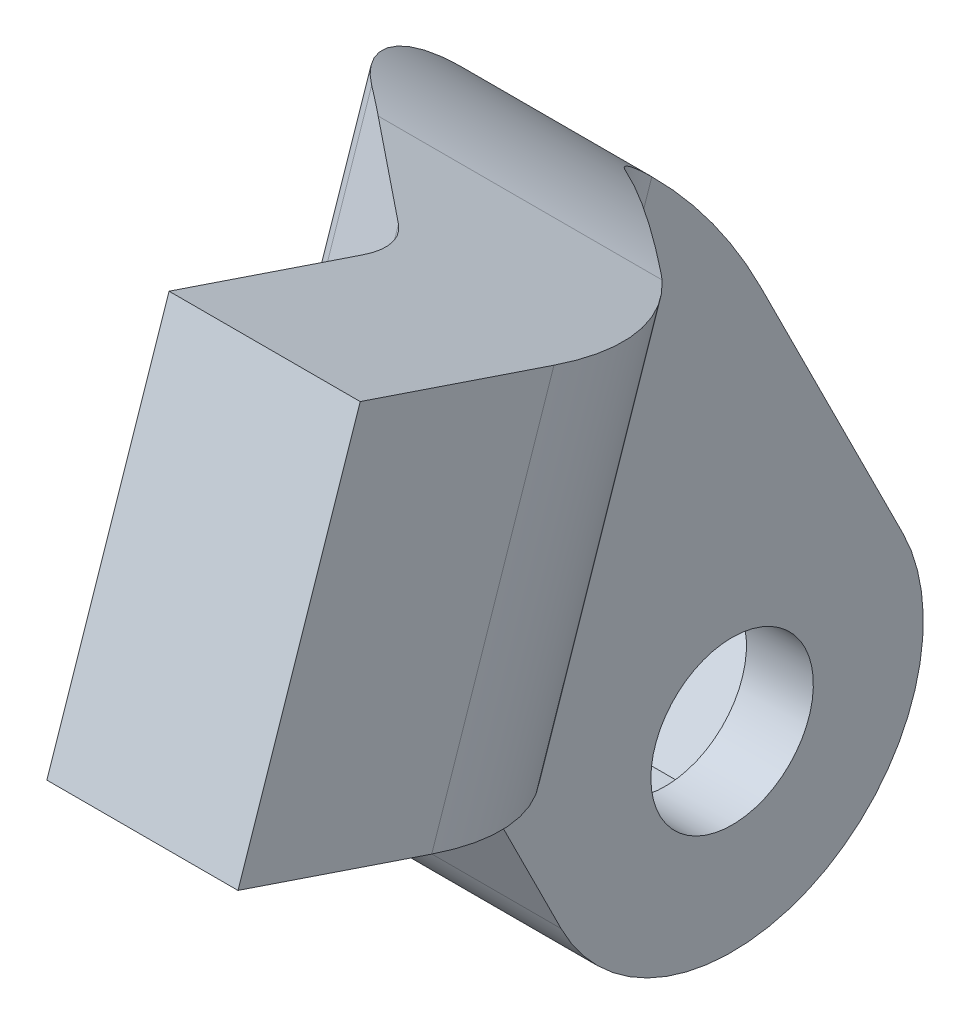
ISO-10303-21;
HEADER;
FILE_DESCRIPTION(('STEP AP214'),'2;1');
FILE_NAME('part.step','',(''),(''),'','','');
FILE_SCHEMA(('AUTOMOTIVE_DESIGN { 1 0 10303 214 1 1 1 1 }'));
ENDSEC;
DATA;
#1=APPLICATION_CONTEXT('core data for automotive mechanical design processes');
#2=APPLICATION_PROTOCOL_DEFINITION('international standard','automotive_design',2000,#1);
#3=PRODUCT_CONTEXT('',#1,'mechanical');
#4=PRODUCT('Part','Part','',(#3));
#5=PRODUCT_RELATED_PRODUCT_CATEGORY('part','',(#4));
#6=PRODUCT_DEFINITION_FORMATION('','',#4);
#7=PRODUCT_DEFINITION_CONTEXT('part definition',#1,'design');
#8=PRODUCT_DEFINITION('design','',#6,#7);
#9=PRODUCT_DEFINITION_SHAPE('','',#8);
#10=(LENGTH_UNIT() NAMED_UNIT(*) SI_UNIT(.MILLI.,.METRE.));
#11=(NAMED_UNIT(*) PLANE_ANGLE_UNIT() SI_UNIT($,.RADIAN.));
#12=(NAMED_UNIT(*) SI_UNIT($,.STERADIAN.) SOLID_ANGLE_UNIT());
#13=UNCERTAINTY_MEASURE_WITH_UNIT(LENGTH_MEASURE(1.E-05),#10,'distance_accuracy_value','');
#14=(GEOMETRIC_REPRESENTATION_CONTEXT(3) GLOBAL_UNCERTAINTY_ASSIGNED_CONTEXT((#13)) GLOBAL_UNIT_ASSIGNED_CONTEXT((#10,
#11,#12)) REPRESENTATION_CONTEXT('',''));
#15=CARTESIAN_POINT('',(0.,0.,0.));
#16=DIRECTION('',(0.,0.,1.));
#17=DIRECTION('',(1.,0.,0.));
#18=AXIS2_PLACEMENT_3D('',#15,#16,#17);
#19=CARTESIAN_POINT('',(0.,-18.8906624923217,-55.9800767633023));
#20=DIRECTION('',(0.,0.319738933124525,0.947505680534102));
#21=DIRECTION('',(0.,-0.947505680534102,0.319738933124525));
#22=AXIS2_PLACEMENT_3D('',#19,#20,#21);
#23=PLANE('',#22);
#24=DIRECTION('',(0.,-0.947505680534102,0.319738933124525));
#25=VECTOR('',#24,1.);
#26=CARTESIAN_POINT('',(43.4,-23.6375643484872,-54.3782189947224));
#27=LINE('',#26,#25);
#28=CARTESIAN_POINT('',(43.4,-36.4251210891344,-50.0630155785074));
#29=VERTEX_POINT('',#28);
#30=CARTESIAN_POINT('',(43.4,-44.0051665334073,-47.5051041135112));
#31=VERTEX_POINT('',#30);
#32=EDGE_CURVE('E243',#29,#31,#27,.T.);
#33=ORIENTED_EDGE('',*,*,#32,.F.);
#34=DIRECTION('',(-1.,0.,0.));
#35=VECTOR('',#34,1.);
#36=CARTESIAN_POINT('',(43.402,-36.4251210891344,-50.0630155785074));
#37=LINE('',#36,#35);
#38=CARTESIAN_POINT('',(39.4,-36.4251210891345,-50.0630155785074));
#39=VERTEX_POINT('',#38);
#40=EDGE_CURVE('E239',#29,#39,#37,.T.);
#41=ORIENTED_EDGE('',*,*,#40,.T.);
#42=DIRECTION('',(0.,0.947505680534102,-0.319738933124525));
#43=VECTOR('',#42,1.);
#44=CARTESIAN_POINT('',(39.4,92.1516164175884,-93.4516619155485));
#45=LINE('',#44,#43);
#46=CARTESIAN_POINT('',(39.4,-44.0051665334073,-47.5051041135112));
#47=VERTEX_POINT('',#46);
#48=EDGE_CURVE('E54',#47,#39,#45,.T.);
#49=ORIENTED_EDGE('',*,*,#48,.F.);
#50=DIRECTION('',(-1.,0.,0.));
#51=VECTOR('',#50,1.);
#52=CARTESIAN_POINT('',(43.402,-44.0051665334073,-47.5051041135112));
#53=LINE('',#52,#51);
#54=EDGE_CURVE('E246',#31,#47,#53,.T.);
#55=ORIENTED_EDGE('',*,*,#54,.F.);
#56=EDGE_LOOP('',(#33,#41,#49,#55));
#57=FACE_BOUND('',#56,.T.);
#58=ADVANCED_FACE('F50',(#57),#23,.T.);
#59=CARTESIAN_POINT('',(43.4,-20.2560833651572,-44.357629981637));
#60=DIRECTION('',(1.,0.,0.));
#61=DIRECTION('',(0.,0.,1.));
#62=AXIS2_PLACEMENT_3D('',#59,#60,#61);
#63=PLANE('',#62);
#64=DIRECTION('',(0.,0.319738933124525,0.947505680534101));
#65=VECTOR('',#64,1.);
#66=CARTESIAN_POINT('',(43.4,-35.7175300268508,-47.966159420087));
#67=LINE('',#66,#65);
#68=CARTESIAN_POINT('',(43.4,-37.7928883758748,-54.1162200512028));
#69=VERTEX_POINT('',#68);
#70=EDGE_CURVE('E195',#69,#29,#67,.T.);
#71=ORIENTED_EDGE('',*,*,#70,.T.);
#72=ORIENTED_EDGE('',*,*,#32,.T.);
#73=DIRECTION('',(0.,0.319738933124525,0.947505680534101));
#74=VECTOR('',#73,1.);
#75=CARTESIAN_POINT('',(43.4,-43.2975754711236,-45.4082479550907));
#76=LINE('',#75,#74);
#77=CARTESIAN_POINT('',(43.4,-45.3729338201476,-51.5583085862066));
#78=VERTEX_POINT('',#77);
#79=EDGE_CURVE('E206',#78,#31,#76,.T.);
#80=ORIENTED_EDGE('',*,*,#79,.F.);
#81=DIRECTION('',(0.,-0.947505680534102,0.319738933124524));
#82=VECTOR('',#81,1.);
#83=CARTESIAN_POINT('',(43.4,-25.0053316352276,-58.4314234674178));
#84=LINE('',#83,#82);
#85=EDGE_CURVE('E425',#78,#69,#84,.F.);
#86=ORIENTED_EDGE('',*,*,#85,.T.);
#87=EDGE_LOOP('',(#71,#72,#80,#86));
#88=FACE_BOUND('',#87,.T.);
#89=ADVANCED_FACE('F576',(#88),#63,.T.);
#90=CARTESIAN_POINT('',(43.402,-43.2975754711236,-45.4082479550907));
#91=DIRECTION('',(0.,-0.947505680534101,0.319738933124525));
#92=DIRECTION('',(-1.,0.,0.));
#93=AXIS2_PLACEMENT_3D('',#90,#91,#92);
#94=PLANE('',#93);
#95=ORIENTED_EDGE('',*,*,#79,.T.);
#96=ORIENTED_EDGE('',*,*,#54,.T.);
#97=DIRECTION('',(0.,-0.319738933124525,-0.947505680534101));
#98=VECTOR('',#97,1.);
#99=CARTESIAN_POINT('',(39.4,-43.2975754711236,-45.4082479550907));
#100=LINE('',#99,#98);
#101=CARTESIAN_POINT('',(39.4,-45.3729338201477,-51.5583085862068));
#102=VERTEX_POINT('',#101);
#103=EDGE_CURVE('E188',#47,#102,#100,.T.);
#104=ORIENTED_EDGE('',*,*,#103,.T.);
#105=CARTESIAN_POINT('',(37.4,-45.3729338201477,-51.5583085862069));
#106=DIRECTION('',(0.,-0.947505680534101,0.319738933124525));
#107=DIRECTION('',(0.,-0.319738933124525,-0.947505680534101));
#108=AXIS2_PLACEMENT_3D('',#105,#106,#107);
#109=CIRCLE('',#108,2.);
#110=CARTESIAN_POINT('',(38.7453455879925,-45.8461091194351,-52.9605034318016));
#111=VERTEX_POINT('',#110);
#112=EDGE_CURVE('E360',#102,#111,#109,.F.);
#113=ORIENTED_EDGE('',*,*,#112,.T.);
#114=DIRECTION('',(-0.739940073395944,-0.215079681494274,-0.637361293452252));
#115=VECTOR('',#114,1.);
#116=CARTESIAN_POINT('',(45.2622185620999,-43.9518381993904,-47.347072375178));
#117=LINE('',#116,#115);
#118=CARTESIAN_POINT('',(35.6836898389875,-46.7360459765091,-55.5977181718217));
#119=VERTEX_POINT('',#118);
#120=EDGE_CURVE('E202',#111,#119,#117,.T.);
#121=ORIENTED_EDGE('',*,*,#120,.T.);
#122=DIRECTION('',(-1.,0.,0.));
#123=VECTOR('',#122,1.);
#124=CARTESIAN_POINT('',(39.8171156980138,-46.7360459765091,-55.5977181718217));
#125=LINE('',#124,#123);
#126=CARTESIAN_POINT('',(41.6219776703366,-46.7360459765091,-55.5977181718217));
#127=VERTEX_POINT('',#126);
#128=EDGE_CURVE('E348',#119,#127,#125,.F.);
#129=ORIENTED_EDGE('',*,*,#128,.T.);
#130=CARTESIAN_POINT('',(37.4,-45.3729338201476,-51.5583085862066));
#131=DIRECTION('',(0.,-0.947505680534101,0.319738933124525));
#132=DIRECTION('',(0.,-0.319738933124525,-0.947505680534101));
#133=AXIS2_PLACEMENT_3D('',#130,#131,#132);
#134=CIRCLE('',#133,6.);
#135=EDGE_CURVE('E327',#127,#78,#134,.T.);
#136=ORIENTED_EDGE('',*,*,#135,.T.);
#137=EDGE_LOOP('',(#95,#96,#104,#113,#121,#129,#136));
#138=FACE_BOUND('',#137,.T.);
#139=ADVANCED_FACE('F563',(#138),#94,.T.);
#140=CARTESIAN_POINT('',(43.402,-35.7175300268508,-47.966159420087));
#141=DIRECTION('',(0.,-0.947505680534102,0.319738933124524));
#142=DIRECTION('',(-1.,0.,0.));
#143=AXIS2_PLACEMENT_3D('',#140,#141,#142);
#144=PLANE('',#143);
#145=ORIENTED_EDGE('',*,*,#40,.F.);
#146=ORIENTED_EDGE('',*,*,#70,.F.);
#147=CARTESIAN_POINT('',(37.4,-37.7928883758748,-54.1162200512028));
#148=DIRECTION('',(0.,-0.947505680534102,0.319738933124524));
#149=DIRECTION('',(0.,-0.319738933124524,-0.947505680534102));
#150=AXIS2_PLACEMENT_3D('',#147,#148,#149);
#151=CIRCLE('',#150,6.);
#152=CARTESIAN_POINT('',(41.6219776703366,-39.1560005322362,-58.1556296368179));
#153=VERTEX_POINT('',#152);
#154=EDGE_CURVE('E428',#69,#153,#151,.F.);
#155=ORIENTED_EDGE('',*,*,#154,.T.);
#156=DIRECTION('',(1.,0.,0.));
#157=VECTOR('',#156,1.);
#158=CARTESIAN_POINT('',(43.402,-39.1560005322362,-58.1556296368178));
#159=LINE('',#158,#157);
#160=CARTESIAN_POINT('',(35.6836898389875,-39.1560005322363,-58.1556296368178));
#161=VERTEX_POINT('',#160);
#162=EDGE_CURVE('E306',#153,#161,#159,.F.);
#163=ORIENTED_EDGE('',*,*,#162,.T.);
#164=DIRECTION('',(-0.739940073395944,-0.215079681494274,-0.637361293452252));
#165=VECTOR('',#164,1.);
#166=CARTESIAN_POINT('',(45.2622185620999,-36.3717927551176,-49.9049838401742));
#167=LINE('',#166,#165);
#168=CARTESIAN_POINT('',(38.7453455879925,-38.2660636751623,-55.5184148967978));
#169=VERTEX_POINT('',#168);
#170=EDGE_CURVE('E207',#169,#161,#167,.T.);
#171=ORIENTED_EDGE('',*,*,#170,.F.);
#172=CARTESIAN_POINT('',(37.4,-37.7928883758749,-54.1162200512031));
#173=DIRECTION('',(0.,-0.947505680534102,0.319738933124524));
#174=DIRECTION('',(0.,-0.319738933124524,-0.947505680534102));
#175=AXIS2_PLACEMENT_3D('',#172,#173,#174);
#176=CIRCLE('',#175,2.);
#177=CARTESIAN_POINT('',(39.4,-37.7928883758749,-54.1162200512031));
#178=VERTEX_POINT('',#177);
#179=EDGE_CURVE('E356',#169,#178,#176,.T.);
#180=ORIENTED_EDGE('',*,*,#179,.T.);
#181=DIRECTION('',(0.,-0.319738933124525,-0.947505680534101));
#182=VECTOR('',#181,1.);
#183=CARTESIAN_POINT('',(39.4,-35.7175300268508,-47.966159420087));
#184=LINE('',#183,#182);
#185=EDGE_CURVE('E226',#39,#178,#184,.T.);
#186=ORIENTED_EDGE('',*,*,#185,.F.);
#187=EDGE_LOOP('',(#145,#146,#155,#163,#171,#180,#186));
#188=FACE_BOUND('',#187,.T.);
#189=ADVANCED_FACE('F572',(#188),#144,.F.);
#190=CARTESIAN_POINT('',(39.4,95.3339005591029,-84.0213674196815));
#191=DIRECTION('',(-1.,0.,0.));
#192=DIRECTION('',(0.,0.,1.));
#193=AXIS2_PLACEMENT_3D('',#190,#191,#192);
#194=PLANE('',#193);
#195=ORIENTED_EDGE('',*,*,#103,.F.);
#196=ORIENTED_EDGE('',*,*,#48,.T.);
#197=ORIENTED_EDGE('',*,*,#185,.T.);
#198=DIRECTION('',(0.,-0.947505680534102,0.319738933124524));
#199=VECTOR('',#198,1.);
#200=CARTESIAN_POINT('',(39.4,-45.3729338201477,-51.5583085862069));
#201=LINE('',#200,#199);
#202=EDGE_CURVE('E372',#178,#102,#201,.T.);
#203=ORIENTED_EDGE('',*,*,#202,.T.);
#204=EDGE_LOOP('',(#195,#196,#197,#203));
#205=FACE_BOUND('',#204,.T.);
#206=ADVANCED_FACE('F52',(#205),#194,.T.);
#207=CARTESIAN_POINT('',(40.1,88.9759750788682,-102.862271309821));
#208=DIRECTION('',(0.672672793996313,-0.236587649643701,-0.701097422797476));
#209=DIRECTION('',(0.,-0.947505680534102,0.319738933124525));
#210=AXIS2_PLACEMENT_3D('',#207,#208,#209);
#211=PLANE('',#210);
#212=DIRECTION('',(0.,-0.947505680534102,0.319738933124524));
#213=VECTOR('',#212,1.);
#214=CARTESIAN_POINT('',(37.4546544120074,-40.3696896788096,-61.7522431287788));
#215=LINE('',#214,#213);
#216=CARTESIAN_POINT('',(37.4546544120073,-49.9696686840529,-58.5126983870269));
#217=VERTEX_POINT('',#216);
#218=CARTESIAN_POINT('',(37.4546544120074,-40.9535248837889,-61.5552260032927));
#219=VERTEX_POINT('',#218);
#220=EDGE_CURVE('E376',#217,#219,#215,.F.);
#221=ORIENTED_EDGE('',*,*,#220,.T.);
#222=CARTESIAN_POINT('',(41.6301173379151,-50.5260686986454,-54.3187624393236));
#223=DIRECTION('',(0.672672793996313,-0.236587649643701,-0.701097422797476));
#224=DIRECTION('',(0.739940073395943,0.215079681494274,0.637361293452252));
#225=AXIS2_PLACEMENT_3D('',#222,#223,#224);
#226=ELLIPSE('',#225,17.8392824967822,12.);
#227=CARTESIAN_POINT('',(41.4360367639779,-39.2136433329861,-58.3223898378694));
#228=VERTEX_POINT('',#227);
#229=EDGE_CURVE('E305',#219,#228,#226,.T.);
#230=ORIENTED_EDGE('',*,*,#229,.T.);
#231=DIRECTION('',(0.,-0.947505680534102,0.319738933124524));
#232=VECTOR('',#231,1.);
#233=CARTESIAN_POINT('',(41.4360367639779,89.3643232329859,-101.711450925029));
#234=LINE('',#233,#232);
#235=CARTESIAN_POINT('',(41.4360367639779,-46.7961484915871,-55.7636483341186));
#236=VERTEX_POINT('',#235);
#237=EDGE_CURVE('E336',#228,#236,#234,.T.);
#238=ORIENTED_EDGE('',*,*,#237,.T.);
#239=CARTESIAN_POINT('',(41.6301173379151,-50.5260686986454,-54.3187624393236));
#240=DIRECTION('',(0.672672793996313,-0.236587649643701,-0.701097422797476));
#241=DIRECTION('',(0.739940073395943,0.215079681494274,0.637361293452252));
#242=AXIS2_PLACEMENT_3D('',#239,#240,#241);
#243=ELLIPSE('',#242,5.94642749892732,3.99999999999995);
#244=CARTESIAN_POINT('',(38.5303910537874,-48.7372143166456,-57.8964712033232));
#245=VERTEX_POINT('',#244);
#246=EDGE_CURVE('E340',#236,#245,#243,.F.);
#247=ORIENTED_EDGE('',*,*,#246,.T.);
#248=DIRECTION('',(0.615371207079268,0.705021008196383,0.352510504098192));
#249=VECTOR('',#248,1.);
#250=CARTESIAN_POINT('',(39.476189110999,-47.6536285196916,-57.3546783048462));
#251=LINE('',#250,#249);
#252=EDGE_CURVE('E196',#217,#245,#251,.T.);
#253=ORIENTED_EDGE('',*,*,#252,.F.);
#254=EDGE_LOOP('',(#221,#230,#238,#247,#253));
#255=FACE_BOUND('',#254,.T.);
#256=ADVANCED_FACE('F548',(#255),#211,.T.);
#257=CARTESIAN_POINT('',(36.8,86.4246438836128,-110.422816961254));
#258=DIRECTION('',(1.,0.,0.));
#259=DIRECTION('',(0.,-1.,0.));
#260=AXIS2_PLACEMENT_3D('',#257,#258,#259);
#261=PLANE('',#260);
#262=CARTESIAN_POINT('',(36.8,-52.8891770708178,-64.4445885354087));
#263=DIRECTION('',(1.,0.,0.));
#264=DIRECTION('',(0.,1.,0.));
#265=AXIS2_PLACEMENT_3D('',#262,#263,#264);
#266=CIRCLE('',#265,1.70000000000001);
#267=CARTESIAN_POINT('',(36.8,-51.1891770708178,-64.4445885354087));
#268=VERTEX_POINT('',#267);
#269=EDGE_CURVE('E61',#268,#268,#266,.T.);
#270=ORIENTED_EDGE('',*,*,#269,.F.);
#271=EDGE_LOOP('',(#270));
#272=FACE_BOUND('',#271,.T.);
#273=DIRECTION('',(0.,0.894427190999916,0.447213595499958));
#274=VECTOR('',#273,1.);
#275=CARTESIAN_POINT('',(36.8,-45.27635755345,-65.1103147317246));
#276=LINE('',#275,#274);
#277=CARTESIAN_POINT('',(36.8,-51.1003226888178,-68.0222972994082));
#278=VERTEX_POINT('',#277);
#279=CARTESIAN_POINT('',(36.8,-45.1595055526459,-65.0518887313226));
#280=VERTEX_POINT('',#279);
#281=EDGE_CURVE('E190',#278,#280,#276,.T.);
#282=ORIENTED_EDGE('',*,*,#281,.T.);
#283=CARTESIAN_POINT('',(36.8,-50.5260686986454,-54.3187624393236));
#284=DIRECTION('',(1.,0.,0.));
#285=DIRECTION('',(0.,1.,0.));
#286=AXIS2_PLACEMENT_3D('',#283,#284,#285);
#287=CIRCLE('',#286,12.);
#288=CARTESIAN_POINT('',(36.8,-42.0006677095905,-62.7637336042135));
#289=VERTEX_POINT('',#288);
#290=EDGE_CURVE('E446',#280,#289,#287,.T.);
#291=ORIENTED_EDGE('',*,*,#290,.T.);
#292=DIRECTION('',(0.,-0.947505680534102,0.319738933124524));
#293=VECTOR('',#292,1.);
#294=CARTESIAN_POINT('',(36.8,-51.0025815864427,-59.7260079227789));
#295=LINE('',#294,#293);
#296=CARTESIAN_POINT('',(36.8,-51.8346913552604,-59.4452097226306));
#297=VERTEX_POINT('',#296);
#298=EDGE_CURVE('E201',#289,#297,#295,.T.);
#299=ORIENTED_EDGE('',*,*,#298,.T.);
#300=DIRECTION('',(0.,0.894427190999916,0.447213595499958));
#301=VECTOR('',#300,1.);
#302=CARTESIAN_POINT('',(36.8,-50.3949153266872,-58.725321708344));
#303=LINE('',#302,#301);
#304=CARTESIAN_POINT('',(36.8,-54.6780314528174,-60.8668797714091));
#305=VERTEX_POINT('',#304);
#306=EDGE_CURVE('E200',#305,#297,#303,.T.);
#307=ORIENTED_EDGE('',*,*,#306,.F.);
#308=CARTESIAN_POINT('',(36.8,-52.8891770708177,-64.4445885354086));
#309=DIRECTION('',(1.,0.,0.));
#310=DIRECTION('',(0.,1.,0.));
#311=AXIS2_PLACEMENT_3D('',#308,#309,#310);
#312=CIRCLE('',#311,4.);
#313=EDGE_CURVE('E178',#305,#278,#312,.T.);
#314=ORIENTED_EDGE('',*,*,#313,.T.);
#315=EDGE_LOOP('',(#282,#291,#299,#307,#314));
#316=FACE_BOUND('',#315,.T.);
#317=ADVANCED_FACE('F540',(#272,#316),#261,.T.);
#318=CARTESIAN_POINT('',(36.1,89.5417465806057,-101.185679389838));
#319=DIRECTION('',(-0.672672793996313,0.236587649643701,0.701097422797477));
#320=DIRECTION('',(0.331789506669584,0.943353445567437,0.));
#321=AXIS2_PLACEMENT_3D('',#318,#319,#320);
#322=PLANE('',#321);
#323=ORIENTED_EDGE('',*,*,#170,.T.);
#324=CARTESIAN_POINT('',(35.6836898389879,-50.5260686986454,-54.3187624393236));
#325=DIRECTION('',(-0.672672793996313,0.236587649643701,0.701097422797477));
#326=DIRECTION('',(0.739940073395943,0.215079681494274,0.637361293452252));
#327=AXIS2_PLACEMENT_3D('',#324,#325,#326);
#328=ELLIPSE('',#327,17.8392824967822,12.);
#329=CARTESIAN_POINT('',(34.7639632360221,-39.4509722541795,-58.9385285314304));
#330=VERTEX_POINT('',#329);
#331=EDGE_CURVE('E269',#161,#330,#328,.T.);
#332=ORIENTED_EDGE('',*,*,#331,.T.);
#333=DIRECTION('',(0.,-0.947505680534102,0.319738933124524));
#334=VECTOR('',#333,1.);
#335=CARTESIAN_POINT('',(34.7639632360221,89.1533984264881,-102.33649977463));
#336=LINE('',#335,#334);
#337=CARTESIAN_POINT('',(34.7639632360221,-47.087108056913,-56.3616891890175));
#338=VERTEX_POINT('',#337);
#339=EDGE_CURVE('E431',#330,#338,#336,.T.);
#340=ORIENTED_EDGE('',*,*,#339,.T.);
#341=CARTESIAN_POINT('',(35.6836898389879,-50.5260686986454,-54.3187624393236));
#342=DIRECTION('',(-0.672672793996313,0.236587649643701,0.701097422797477));
#343=DIRECTION('',(0.739940073395943,0.215079681494274,0.637361293452252));
#344=AXIS2_PLACEMENT_3D('',#341,#342,#343);
#345=ELLIPSE('',#344,5.94642749892732,3.99999999999995);
#346=EDGE_CURVE('E344',#338,#119,#345,.F.);
#347=ORIENTED_EDGE('',*,*,#346,.T.);
#348=ORIENTED_EDGE('',*,*,#120,.F.);
#349=DIRECTION('',(0.,-0.947505680534102,0.319738933124524));
#350=VECTOR('',#349,1.);
#351=CARTESIAN_POINT('',(38.7453455879926,-38.2660636751622,-55.518414896798));
#352=LINE('',#351,#350);
#353=EDGE_CURVE('E368',#111,#169,#352,.F.);
#354=ORIENTED_EDGE('',*,*,#353,.T.);
#355=EDGE_LOOP('',(#323,#332,#340,#347,#348,#354));
#356=FACE_BOUND('',#355,.T.);
#357=ADVANCED_FACE('F461',(#356),#322,.T.);
#358=CARTESIAN_POINT('',(43.402,-50.3949153266872,-58.725321708344));
#359=DIRECTION('',(0.,-0.447213595499958,0.894427190999916));
#360=DIRECTION('',(-1.,0.,0.));
#361=AXIS2_PLACEMENT_3D('',#358,#359,#360);
#362=PLANE('',#361);
#363=DIRECTION('',(-1.,0.,0.));
#364=VECTOR('',#363,1.);
#365=CARTESIAN_POINT('',(33.8706881990866,-48.7372143166456,-57.8964712033232));
#366=LINE('',#365,#364);
#367=CARTESIAN_POINT('',(33.3265085803917,-48.7372143166456,-57.8964712033232));
#368=VERTEX_POINT('',#367);
#369=EDGE_CURVE('E352',#245,#368,#366,.T.);
#370=ORIENTED_EDGE('',*,*,#369,.T.);
#371=CARTESIAN_POINT('',(38.8,-51.8346913552607,-59.4452097226308));
#372=DIRECTION('',(0.,-0.447213595499958,0.894427190999916));
#373=DIRECTION('',(0.,-0.894427190999916,-0.447213595499958));
#374=AXIS2_PLACEMENT_3D('',#371,#372,#373);
#375=ELLIPSE('',#374,8.45403085129275,6.);
#376=CARTESIAN_POINT('',(32.8,-51.8346913552607,-59.4452097226308));
#377=VERTEX_POINT('',#376);
#378=EDGE_CURVE('E435',#368,#377,#375,.T.);
#379=ORIENTED_EDGE('',*,*,#378,.T.);
#380=DIRECTION('',(0.,-0.894427190999916,-0.447213595499958));
#381=VECTOR('',#380,1.);
#382=CARTESIAN_POINT('',(32.8,-50.3949153266872,-58.725321708344));
#383=LINE('',#382,#381);
#384=CARTESIAN_POINT('',(32.8,-54.6780314528174,-60.8668797714091));
#385=VERTEX_POINT('',#384);
#386=EDGE_CURVE('E184',#377,#385,#383,.T.);
#387=ORIENTED_EDGE('',*,*,#386,.T.);
#388=DIRECTION('',(-1.,0.,0.));
#389=VECTOR('',#388,1.);
#390=CARTESIAN_POINT('',(43.402,-54.6780314528174,-60.8668797714091));
#391=LINE('',#390,#389);
#392=EDGE_CURVE('E183',#305,#385,#391,.T.);
#393=ORIENTED_EDGE('',*,*,#392,.F.);
#394=ORIENTED_EDGE('',*,*,#306,.T.);
#395=CARTESIAN_POINT('',(38.8,-51.8346913552604,-59.4452097226306));
#396=DIRECTION('',(0.,-0.447213595499958,0.894427190999916));
#397=DIRECTION('',(0.,0.894427190999916,0.447213595499958));
#398=AXIS2_PLACEMENT_3D('',#395,#396,#397);
#399=ELLIPSE('',#398,2.81801028376425,2.);
#400=EDGE_CURVE('E364',#297,#217,#399,.F.);
#401=ORIENTED_EDGE('',*,*,#400,.T.);
#402=ORIENTED_EDGE('',*,*,#252,.T.);
#403=EDGE_LOOP('',(#370,#379,#387,#393,#394,#401,#402));
#404=FACE_BOUND('',#403,.T.);
#405=ADVANCED_FACE('F530',(#404),#362,.T.);
#406=CARTESIAN_POINT('',(43.402,-45.27635755345,-65.1103147317246));
#407=DIRECTION('',(0.,-0.447213595499958,0.894427190999916));
#408=DIRECTION('',(-1.,0.,0.));
#409=AXIS2_PLACEMENT_3D('',#406,#407,#408);
#410=PLANE('',#409);
#411=DIRECTION('',(0.,-0.894427190999916,-0.447213595499958));
#412=VECTOR('',#411,1.);
#413=CARTESIAN_POINT('',(32.8,-45.27635755345,-65.1103147317246));
#414=LINE('',#413,#412);
#415=CARTESIAN_POINT('',(32.8,-45.1595055526459,-65.0518887313226));
#416=VERTEX_POINT('',#415);
#417=CARTESIAN_POINT('',(32.8,-51.1003226888178,-68.0222972994082));
#418=VERTEX_POINT('',#417);
#419=EDGE_CURVE('E189',#416,#418,#414,.T.);
#420=ORIENTED_EDGE('',*,*,#419,.F.);
#421=DIRECTION('',(1.,0.,0.));
#422=VECTOR('',#421,1.);
#423=CARTESIAN_POINT('',(43.402,-45.1595055526459,-65.0518887313226));
#424=LINE('',#423,#422);
#425=EDGE_CURVE('E442',#416,#280,#424,.T.);
#426=ORIENTED_EDGE('',*,*,#425,.T.);
#427=ORIENTED_EDGE('',*,*,#281,.F.);
#428=DIRECTION('',(-1.,0.,0.));
#429=VECTOR('',#428,1.);
#430=CARTESIAN_POINT('',(43.402,-51.1003226888178,-68.0222972994082));
#431=LINE('',#430,#429);
#432=EDGE_CURVE('E194',#278,#418,#431,.T.);
#433=ORIENTED_EDGE('',*,*,#432,.T.);
#434=EDGE_LOOP('',(#420,#426,#427,#433));
#435=FACE_BOUND('',#434,.T.);
#436=ADVANCED_FACE('F538',(#435),#410,.F.);
#437=CARTESIAN_POINT('',(43.402,-52.8891770708177,-64.4445885354086));
#438=DIRECTION('',(-1.,0.,0.));
#439=DIRECTION('',(0.,0.,1.));
#440=AXIS2_PLACEMENT_3D('',#437,#438,#439);
#441=CYLINDRICAL_SURFACE('',#440,4.);
#442=ORIENTED_EDGE('',*,*,#313,.F.);
#443=ORIENTED_EDGE('',*,*,#392,.T.);
#444=CARTESIAN_POINT('',(32.8,-52.8891770708177,-64.4445885354086));
#445=DIRECTION('',(-1.,0.,0.));
#446=DIRECTION('',(0.,0.,1.));
#447=AXIS2_PLACEMENT_3D('',#444,#445,#446);
#448=CIRCLE('',#447,4.);
#449=EDGE_CURVE('E182',#418,#385,#448,.T.);
#450=ORIENTED_EDGE('',*,*,#449,.F.);
#451=ORIENTED_EDGE('',*,*,#432,.F.);
#452=EDGE_LOOP('',(#442,#443,#450,#451));
#453=FACE_BOUND('',#452,.T.);
#454=ADVANCED_FACE('F534',(#453),#441,.T.);
#455=CARTESIAN_POINT('',(32.8,86.7075296344816,-109.584521001262));
#456=DIRECTION('',(-1.,0.,0.));
#457=DIRECTION('',(0.,0.,1.));
#458=AXIS2_PLACEMENT_3D('',#455,#456,#457);
#459=PLANE('',#458);
#460=DIRECTION('',(0.,0.894427190999976,0.447213595499838));
#461=VECTOR('',#460,1.);
#462=CARTESIAN_POINT('',(32.8,-55.6354694895521,-62.6313378768388));
#463=LINE('',#462,#461);
#464=CARTESIAN_POINT('',(32.8,-55.6354694895521,-62.6313378768388));
#465=VERTEX_POINT('',#464);
#466=CARTESIAN_POINT('',(32.8,-52.6920021464341,-61.1596042052803));
#467=VERTEX_POINT('',#466);
#468=EDGE_CURVE('E152',#465,#467,#463,.T.);
#469=ORIENTED_EDGE('',*,*,#468,.F.);
#470=DIRECTION('',(0.,0.0599152608792349,0.998203466991461));
#471=VECTOR('',#470,1.);
#472=CARTESIAN_POINT('',(32.8,-55.8326444139361,-65.916322206968));
#473=LINE('',#472,#471);
#474=CARTESIAN_POINT('',(32.8,-55.8326444139361,-65.916322206968));
#475=VERTEX_POINT('',#474);
#476=EDGE_CURVE('E139',#475,#465,#473,.T.);
#477=ORIENTED_EDGE('',*,*,#476,.F.);
#478=DIRECTION('',(0.,-0.834511930120717,0.550989871491479));
#479=VECTOR('',#478,1.);
#480=CARTESIAN_POINT('',(32.8,-53.0863519952023,-67.7295728655383));
#481=LINE('',#480,#479);
#482=CARTESIAN_POINT('',(32.8,-53.0863519952023,-67.7295728655383));
#483=VERTEX_POINT('',#482);
#484=EDGE_CURVE('E117',#483,#475,#481,.T.);
#485=ORIENTED_EDGE('',*,*,#484,.F.);
#486=DIRECTION('',(0.,-0.894427190999916,-0.447213595499957));
#487=VECTOR('',#486,1.);
#488=CARTESIAN_POINT('',(32.8,-50.1428846520847,-66.2578391939795));
#489=LINE('',#488,#487);
#490=CARTESIAN_POINT('',(32.8,-50.1428846520847,-66.2578391939795));
#491=VERTEX_POINT('',#490);
#492=EDGE_CURVE('E129',#491,#483,#489,.T.);
#493=ORIENTED_EDGE('',*,*,#492,.F.);
#494=DIRECTION('',(0.,-0.0599152608792089,-0.998203466991463));
#495=VECTOR('',#494,1.);
#496=CARTESIAN_POINT('',(32.8,-49.9457097277008,-62.9728548638506));
#497=LINE('',#496,#495);
#498=CARTESIAN_POINT('',(32.8,-49.9457097277008,-62.9728548638506));
#499=VERTEX_POINT('',#498);
#500=EDGE_CURVE('E134',#499,#491,#497,.T.);
#501=ORIENTED_EDGE('',*,*,#500,.F.);
#502=DIRECTION('',(0.,0.834511930120669,-0.550989871491551));
#503=VECTOR('',#502,1.);
#504=CARTESIAN_POINT('',(32.8,-52.6920021464341,-61.1596042052803));
#505=LINE('',#504,#503);
#506=EDGE_CURVE('E149',#467,#499,#505,.T.);
#507=ORIENTED_EDGE('',*,*,#506,.F.);
#508=EDGE_LOOP('',(#469,#477,#485,#493,#501,#507));
#509=FACE_BOUND('',#508,.T.);
#510=DIRECTION('',(0.,-0.947505680534102,0.319738933124524));
#511=VECTOR('',#510,1.);
#512=CARTESIAN_POINT('',(32.8,87.7338725286258,-106.543084311415));
#513=LINE('',#512,#511);
#514=CARTESIAN_POINT('',(32.8,-42.0006677095907,-62.7637336042137));
#515=VERTEX_POINT('',#514);
#516=EDGE_CURVE('E439',#377,#515,#513,.F.);
#517=ORIENTED_EDGE('',*,*,#516,.T.);
#518=CARTESIAN_POINT('',(32.8,-50.5260686986454,-54.3187624393236));
#519=DIRECTION('',(-1.,0.,0.));
#520=DIRECTION('',(0.,0.,1.));
#521=AXIS2_PLACEMENT_3D('',#518,#519,#520);
#522=CIRCLE('',#521,12.);
#523=EDGE_CURVE('E255',#515,#416,#522,.T.);
#524=ORIENTED_EDGE('',*,*,#523,.T.);
#525=ORIENTED_EDGE('',*,*,#419,.T.);
#526=ORIENTED_EDGE('',*,*,#449,.T.);
#527=ORIENTED_EDGE('',*,*,#386,.F.);
#528=EDGE_LOOP('',(#517,#524,#525,#526,#527));
#529=FACE_BOUND('',#528,.T.);
#530=ADVANCED_FACE('F137',(#509,#529),#459,.T.);
#531=CARTESIAN_POINT('',(35.4,-55.6354694895521,-62.6313378768388));
#532=DIRECTION('',(0.,-0.447213595499838,0.894427190999976));
#533=DIRECTION('',(0.,-0.894427190999976,-0.447213595499838));
#534=AXIS2_PLACEMENT_3D('',#531,#532,#533);
#535=PLANE('',#534);
#536=ORIENTED_EDGE('',*,*,#468,.T.);
#537=DIRECTION('',(-1.,0.,0.));
#538=VECTOR('',#537,1.);
#539=CARTESIAN_POINT('',(35.4,-52.6920021464341,-61.1596042052803));
#540=LINE('',#539,#538);
#541=CARTESIAN_POINT('',(35.4,-52.6920021464341,-61.1596042052803));
#542=VERTEX_POINT('',#541);
#543=EDGE_CURVE('E98',#542,#467,#540,.T.);
#544=ORIENTED_EDGE('',*,*,#543,.F.);
#545=DIRECTION('',(0.,0.894427190999976,0.447213595499838));
#546=VECTOR('',#545,1.);
#547=CARTESIAN_POINT('',(35.4,-55.6354694895521,-62.6313378768388));
#548=LINE('',#547,#546);
#549=CARTESIAN_POINT('',(35.4,-55.6354694895521,-62.6313378768388));
#550=VERTEX_POINT('',#549);
#551=EDGE_CURVE('E143',#550,#542,#548,.T.);
#552=ORIENTED_EDGE('',*,*,#551,.F.);
#553=DIRECTION('',(-1.,0.,0.));
#554=VECTOR('',#553,1.);
#555=CARTESIAN_POINT('',(35.4,-55.6354694895521,-62.6313378768388));
#556=LINE('',#555,#554);
#557=EDGE_CURVE('E102',#550,#465,#556,.T.);
#558=ORIENTED_EDGE('',*,*,#557,.T.);
#559=EDGE_LOOP('',(#536,#544,#552,#558));
#560=FACE_BOUND('',#559,.T.);
#561=ADVANCED_FACE('F667',(#560),#535,.F.);
#562=CARTESIAN_POINT('',(35.4,-55.8326444139361,-65.916322206968));
#563=DIRECTION('',(0.,-0.998203466991461,0.0599152608792349));
#564=DIRECTION('',(0.,-0.0599152608792349,-0.998203466991461));
#565=AXIS2_PLACEMENT_3D('',#562,#563,#564);
#566=PLANE('',#565);
#567=ORIENTED_EDGE('',*,*,#476,.T.);
#568=ORIENTED_EDGE('',*,*,#557,.F.);
#569=DIRECTION('',(0.,0.0599152608792349,0.998203466991461));
#570=VECTOR('',#569,1.);
#571=CARTESIAN_POINT('',(35.4,-55.8326444139361,-65.916322206968));
#572=LINE('',#571,#570);
#573=CARTESIAN_POINT('',(35.4,-55.8326444139361,-65.916322206968));
#574=VERTEX_POINT('',#573);
#575=EDGE_CURVE('E155',#574,#550,#572,.T.);
#576=ORIENTED_EDGE('',*,*,#575,.F.);
#577=DIRECTION('',(-1.,0.,0.));
#578=VECTOR('',#577,1.);
#579=CARTESIAN_POINT('',(35.4,-55.8326444139361,-65.916322206968));
#580=LINE('',#579,#578);
#581=EDGE_CURVE('E126',#574,#475,#580,.T.);
#582=ORIENTED_EDGE('',*,*,#581,.T.);
#583=EDGE_LOOP('',(#567,#568,#576,#582));
#584=FACE_BOUND('',#583,.T.);
#585=ADVANCED_FACE('F676',(#584),#566,.F.);
#586=CARTESIAN_POINT('',(35.4,-53.0863519952023,-67.7295728655383));
#587=DIRECTION('',(0.,-0.550989871491479,-0.834511930120717));
#588=DIRECTION('',(0.,0.834511930120717,-0.550989871491479));
#589=AXIS2_PLACEMENT_3D('',#586,#587,#588);
#590=PLANE('',#589);
#591=ORIENTED_EDGE('',*,*,#484,.T.);
#592=ORIENTED_EDGE('',*,*,#581,.F.);
#593=DIRECTION('',(0.,-0.834511930120717,0.550989871491479));
#594=VECTOR('',#593,1.);
#595=CARTESIAN_POINT('',(35.4,-53.0863519952023,-67.7295728655383));
#596=LINE('',#595,#594);
#597=CARTESIAN_POINT('',(35.4,-53.0863519952023,-67.7295728655383));
#598=VERTEX_POINT('',#597);
#599=EDGE_CURVE('E120',#598,#574,#596,.T.);
#600=ORIENTED_EDGE('',*,*,#599,.F.);
#601=DIRECTION('',(-1.,0.,0.));
#602=VECTOR('',#601,1.);
#603=CARTESIAN_POINT('',(35.4,-53.0863519952023,-67.7295728655383));
#604=LINE('',#603,#602);
#605=EDGE_CURVE('E113',#598,#483,#604,.T.);
#606=ORIENTED_EDGE('',*,*,#605,.T.);
#607=EDGE_LOOP('',(#591,#592,#600,#606));
#608=FACE_BOUND('',#607,.T.);
#609=ADVANCED_FACE('F115',(#608),#590,.F.);
#610=CARTESIAN_POINT('',(35.4,-50.1428846520847,-66.2578391939795));
#611=DIRECTION('',(0.,0.447213595499957,-0.894427190999916));
#612=DIRECTION('',(0.,0.894427190999916,0.447213595499957));
#613=AXIS2_PLACEMENT_3D('',#610,#611,#612);
#614=PLANE('',#613);
#615=ORIENTED_EDGE('',*,*,#492,.T.);
#616=ORIENTED_EDGE('',*,*,#605,.F.);
#617=DIRECTION('',(0.,-0.894427190999916,-0.447213595499957));
#618=VECTOR('',#617,1.);
#619=CARTESIAN_POINT('',(35.4,-50.1428846520847,-66.2578391939795));
#620=LINE('',#619,#618);
#621=CARTESIAN_POINT('',(35.4,-50.1428846520847,-66.2578391939795));
#622=VERTEX_POINT('',#621);
#623=EDGE_CURVE('E161',#622,#598,#620,.T.);
#624=ORIENTED_EDGE('',*,*,#623,.F.);
#625=DIRECTION('',(-1.,0.,0.));
#626=VECTOR('',#625,1.);
#627=CARTESIAN_POINT('',(35.4,-50.1428846520847,-66.2578391939795));
#628=LINE('',#627,#626);
#629=EDGE_CURVE('E125',#622,#491,#628,.T.);
#630=ORIENTED_EDGE('',*,*,#629,.T.);
#631=EDGE_LOOP('',(#615,#616,#624,#630));
#632=FACE_BOUND('',#631,.T.);
#633=ADVANCED_FACE('F130',(#632),#614,.F.);
#634=CARTESIAN_POINT('',(35.4,-49.9457097277008,-62.9728548638506));
#635=DIRECTION('',(0.,0.998203466991463,-0.0599152608792089));
#636=DIRECTION('',(0.,0.0599152608792089,0.998203466991463));
#637=AXIS2_PLACEMENT_3D('',#634,#635,#636);
#638=PLANE('',#637);
#639=ORIENTED_EDGE('',*,*,#500,.T.);
#640=ORIENTED_EDGE('',*,*,#629,.F.);
#641=DIRECTION('',(0.,-0.0599152608792089,-0.998203466991463));
#642=VECTOR('',#641,1.);
#643=CARTESIAN_POINT('',(35.4,-49.9457097277008,-62.9728548638506));
#644=LINE('',#643,#642);
#645=CARTESIAN_POINT('',(35.4,-49.9457097277008,-62.9728548638506));
#646=VERTEX_POINT('',#645);
#647=EDGE_CURVE('E164',#646,#622,#644,.T.);
#648=ORIENTED_EDGE('',*,*,#647,.F.);
#649=DIRECTION('',(-1.,0.,0.));
#650=VECTOR('',#649,1.);
#651=CARTESIAN_POINT('',(35.4,-49.9457097277008,-62.9728548638506));
#652=LINE('',#651,#650);
#653=EDGE_CURVE('E70',#646,#499,#652,.T.);
#654=ORIENTED_EDGE('',*,*,#653,.T.);
#655=EDGE_LOOP('',(#639,#640,#648,#654));
#656=FACE_BOUND('',#655,.T.);
#657=ADVANCED_FACE('F698',(#656),#638,.F.);
#658=CARTESIAN_POINT('',(35.4,-52.6920021464341,-61.1596042052803));
#659=DIRECTION('',(0.,0.550989871491551,0.834511930120669));
#660=DIRECTION('',(0.,-0.834511930120669,0.550989871491551));
#661=AXIS2_PLACEMENT_3D('',#658,#659,#660);
#662=PLANE('',#661);
#663=ORIENTED_EDGE('',*,*,#506,.T.);
#664=ORIENTED_EDGE('',*,*,#653,.F.);
#665=DIRECTION('',(0.,0.834511930120669,-0.550989871491551));
#666=VECTOR('',#665,1.);
#667=CARTESIAN_POINT('',(35.4,-52.6920021464341,-61.1596042052803));
#668=LINE('',#667,#666);
#669=EDGE_CURVE('E168',#542,#646,#668,.T.);
#670=ORIENTED_EDGE('',*,*,#669,.F.);
#671=ORIENTED_EDGE('',*,*,#543,.T.);
#672=EDGE_LOOP('',(#663,#664,#670,#671));
#673=FACE_BOUND('',#672,.T.);
#674=ADVANCED_FACE('F706',(#673),#662,.F.);
#675=CARTESIAN_POINT('',(35.4,0.,0.));
#676=DIRECTION('',(-1.,0.,0.));
#677=DIRECTION('',(0.,0.,1.));
#678=AXIS2_PLACEMENT_3D('',#675,#676,#677);
#679=PLANE('',#678);
#680=CARTESIAN_POINT('',(35.4,-52.8891770708178,-64.4445885354087));
#681=DIRECTION('',(-1.,0.,0.));
#682=DIRECTION('',(0.,0.,1.));
#683=AXIS2_PLACEMENT_3D('',#680,#681,#682);
#684=CIRCLE('',#683,1.70000000000001);
#685=CARTESIAN_POINT('',(35.4,-52.8891770708178,-62.7445885354087));
#686=VERTEX_POINT('',#685);
#687=EDGE_CURVE('E11',#686,#686,#684,.T.);
#688=ORIENTED_EDGE('',*,*,#687,.F.);
#689=EDGE_LOOP('',(#688));
#690=FACE_BOUND('',#689,.T.);
#691=ORIENTED_EDGE('',*,*,#551,.T.);
#692=ORIENTED_EDGE('',*,*,#669,.T.);
#693=ORIENTED_EDGE('',*,*,#647,.T.);
#694=ORIENTED_EDGE('',*,*,#623,.T.);
#695=ORIENTED_EDGE('',*,*,#599,.T.);
#696=ORIENTED_EDGE('',*,*,#575,.T.);
#697=EDGE_LOOP('',(#691,#692,#693,#694,#695,#696));
#698=FACE_BOUND('',#697,.T.);
#699=ADVANCED_FACE('F714',(#690,#698),#679,.T.);
#700=CARTESIAN_POINT('',(35.4,-52.8891770708178,-64.4445885354087));
#701=DIRECTION('',(-1.,0.,0.));
#702=DIRECTION('',(0.,0.,1.));
#703=AXIS2_PLACEMENT_3D('',#700,#701,#702);
#704=CYLINDRICAL_SURFACE('',#703,1.70000000000001);
#705=ORIENTED_EDGE('',*,*,#269,.T.);
#706=EDGE_LOOP('',(#705));
#707=FACE_BOUND('',#706,.T.);
#708=ORIENTED_EDGE('',*,*,#687,.T.);
#709=EDGE_LOOP('',(#708));
#710=FACE_BOUND('',#709,.T.);
#711=ADVANCED_FACE('F591',(#707,#710),#704,.F.);
#712=CARTESIAN_POINT('',(38.8,87.733872528626,-106.543084311415));
#713=DIRECTION('',(0.,0.947505680534102,-0.319738933124524));
#714=DIRECTION('',(0.,0.319738933124524,0.947505680534102));
#715=AXIS2_PLACEMENT_3D('',#712,#713,#714);
#716=CYLINDRICAL_SURFACE('',#715,2.);
#717=ORIENTED_EDGE('',*,*,#298,.F.);
#718=CARTESIAN_POINT('',(36.8,-42.0006677095905,-62.7637336042135));
#719=CARTESIAN_POINT('',(36.8000038263767,-41.9558088739573,-62.7184506947138));
#720=CARTESIAN_POINT('',(36.8024602547531,-41.9113305433703,-62.672822873549));
#721=CARTESIAN_POINT('',(36.8123948815269,-41.823352234527,-62.5811325935865));
#722=CARTESIAN_POINT('',(36.8198754905452,-41.7798527362776,-62.5350699366181));
#723=CARTESIAN_POINT('',(36.8501012238339,-41.6508884899162,-62.3963296103612));
#724=CARTESIAN_POINT('',(36.8806321216084,-41.5673013849835,-62.303446734878));
#725=CARTESIAN_POINT('',(36.9627841408244,-41.4073410690923,-62.1202802521505));
#726=CARTESIAN_POINT('',(37.0144746337429,-41.3309926137383,-62.0300062503231));
#727=CARTESIAN_POINT('',(37.1382439474893,-41.1881386201329,-61.8563770406311));
#728=CARTESIAN_POINT('',(37.2102399065136,-41.1215947181703,-61.7729954586151));
#729=CARTESIAN_POINT('',(37.3168822591758,-41.0417941138523,-61.6705996612006));
#730=CARTESIAN_POINT('',(37.3432264605205,-41.0233242949763,-61.6467034925186));
#731=CARTESIAN_POINT('',(37.3976512543214,-40.9875487034879,-61.6000735959795));
#732=CARTESIAN_POINT('',(37.4257311181927,-40.9702424487262,-61.577339387586));
#733=CARTESIAN_POINT('',(37.4546544120071,-40.9535248837887,-61.5552260032926));
#734=B_SPLINE_CURVE_WITH_KNOTS('',3,(#718,#719,#720,#721,#722,#723,#724,#725,#726,#727,#728,
#729,#730,#731,#732,#733),.UNSPECIFIED.,.F.,.F.,(4,2,2,2,2,2,2,4),(0.,0.191121433329032,
0.38233463301791,0.766208502071845,1.15135110692958,1.53494422802893,1.65512427509488,
1.77525421194478),.UNSPECIFIED.);
#735=EDGE_CURVE('E289',#289,#219,#734,.T.);
#736=ORIENTED_EDGE('',*,*,#735,.T.);
#737=ORIENTED_EDGE('',*,*,#220,.F.);
#738=ORIENTED_EDGE('',*,*,#400,.F.);
#739=EDGE_LOOP('',(#717,#736,#737,#738));
#740=FACE_BOUND('',#739,.T.);
#741=ADVANCED_FACE('F551',(#740),#716,.F.);
#742=CARTESIAN_POINT('',(37.4,90.783849130848,-97.5048663882441));
#743=DIRECTION('',(0.,0.947505680534102,-0.319738933124524));
#744=DIRECTION('',(0.,0.319738933124524,0.947505680534102));
#745=AXIS2_PLACEMENT_3D('',#742,#743,#744);
#746=CYLINDRICAL_SURFACE('',#745,2.);
#747=ORIENTED_EDGE('',*,*,#179,.F.);
#748=ORIENTED_EDGE('',*,*,#353,.F.);
#749=ORIENTED_EDGE('',*,*,#112,.F.);
#750=ORIENTED_EDGE('',*,*,#202,.F.);
#751=EDGE_LOOP('',(#747,#748,#749,#750));
#752=FACE_BOUND('',#751,.T.);
#753=ADVANCED_FACE('F568',(#752),#746,.F.);
#754=CARTESIAN_POINT('',(43.402,-50.5260686986454,-54.3187624393236));
#755=DIRECTION('',(1.,0.,0.));
#756=DIRECTION('',(0.,0.,-1.));
#757=AXIS2_PLACEMENT_3D('',#754,#755,#756);
#758=CYLINDRICAL_SURFACE('',#757,3.99999999999995);
#759=ORIENTED_EDGE('',*,*,#246,.F.);
#760=CARTESIAN_POINT('',(41.4360367639779,-46.7961484915871,-55.7636483341186));
#761=CARTESIAN_POINT('',(41.4676481334349,-46.7857442436933,-55.7368296789557));
#762=CARTESIAN_POINT('',(41.4989488936957,-46.7755335768224,-55.7095928378472));
#763=CARTESIAN_POINT('',(41.5609291958151,-46.7554994051299,-55.654282783748));
#764=CARTESIAN_POINT('',(41.5916087376739,-46.745675900308,-55.6262095707575));
#765=CARTESIAN_POINT('',(41.6219776703366,-46.7360459765091,-55.5977181718217));
#766=B_SPLINE_CURVE_WITH_KNOTS('',3,(#760,#761,#762,#763,#764,#765),.UNSPECIFIED.,.F.,.F.,(4,2,
4),(0.,0.12818957609641,0.256379152152101),.UNSPECIFIED.);
#767=EDGE_CURVE('E317',#236,#127,#766,.T.);
#768=ORIENTED_EDGE('',*,*,#767,.T.);
#769=ORIENTED_EDGE('',*,*,#128,.F.);
#770=ORIENTED_EDGE('',*,*,#346,.F.);
#771=CARTESIAN_POINT('',(34.7639632360221,-47.087108056913,-56.3616891890175));
#772=CARTESIAN_POINT('',(34.6807479297039,-47.1265957942941,-56.4281700958614));
#773=CARTESIAN_POINT('',(34.5999538057454,-47.1693812202266,-56.4957927361979));
#774=CARTESIAN_POINT('',(34.4435935573267,-47.2620215681538,-56.6323749950396));
#775=CARTESIAN_POINT('',(34.3680318303565,-47.3118823317375,-56.7013356772433));
#776=CARTESIAN_POINT('',(34.2248607253161,-47.4174617227275,-56.8374432692029));
#777=CARTESIAN_POINT('',(34.1570799197072,-47.4729574907322,-56.9045819333894));
#778=CARTESIAN_POINT('',(34.0273057959974,-47.5911890970177,-57.0380316410626));
#779=CARTESIAN_POINT('',(33.9653106712337,-47.6539226614157,-57.1043429372658));
#780=CARTESIAN_POINT('',(33.8455189146687,-47.7887725202471,-57.2370548496568));
#781=CARTESIAN_POINT('',(33.7879138496281,-47.8611206410968,-57.3033935894903));
#782=CARTESIAN_POINT('',(33.6792940838851,-48.0134152071288,-57.432691956172));
#783=CARTESIAN_POINT('',(33.6282801336816,-48.0933625157989,-57.4956511977364));
#784=CARTESIAN_POINT('',(33.5313480365909,-48.2631061501763,-57.618810006876));
#785=CARTESIAN_POINT('',(33.4856437033889,-48.3531349313645,-57.6788580040948));
#786=CARTESIAN_POINT('',(33.4010275900581,-48.5401501902363,-57.7926955437023));
#787=CARTESIAN_POINT('',(33.3621193891555,-48.6371402964365,-57.8464817833537));
#788=CARTESIAN_POINT('',(33.3265085803917,-48.7372143166456,-57.8964712033232));
#789=B_SPLINE_CURVE_WITH_KNOTS('',3,(#771,#772,#773,#774,#775,#776,#777,#778,#779,#780,#781,
#782,#783,#784,#785,#786,#787,#788),.UNSPECIFIED.,.F.,.F.,(4,2,2,2,2,2,2,2,4),(0.,
0.34076897920005,0.681820961333373,1.01255484105871,1.34318509633796,1.68414024544969,
2.02513418336135,2.37697907838327,2.7290087196709),.UNSPECIFIED.);
#790=EDGE_CURVE('E326',#338,#368,#789,.T.);
#791=ORIENTED_EDGE('',*,*,#790,.T.);
#792=ORIENTED_EDGE('',*,*,#369,.F.);
#793=EDGE_LOOP('',(#759,#768,#769,#770,#791,#792));
#794=FACE_BOUND('',#793,.T.);
#795=ADVANCED_FACE('F311',(#794),#758,.F.);
#796=CARTESIAN_POINT('',(37.4,90.7838491308481,-97.5048663882439));
#797=DIRECTION('',(0.,-0.947505680534102,0.319738933124524));
#798=DIRECTION('',(0.,-0.319738933124524,-0.947505680534102));
#799=AXIS2_PLACEMENT_3D('',#796,#797,#798);
#800=CYLINDRICAL_SURFACE('',#799,6.);
#801=ORIENTED_EDGE('',*,*,#237,.F.);
#802=CARTESIAN_POINT('',(41.4360367639779,-39.2136433329861,-58.3223898378694));
#803=CARTESIAN_POINT('',(41.4676543457233,-39.2040479079217,-58.2952920214336));
#804=CARTESIAN_POINT('',(41.4989582121263,-39.1944466286602,-58.2678464297944));
#805=CARTESIAN_POINT('',(41.5609385142458,-39.1752323617436,-58.2122596961105));
#806=CARTESIAN_POINT('',(41.5916149499625,-39.1656193740884,-58.1841185540658));
#807=CARTESIAN_POINT('',(41.6219776703366,-39.1560005322362,-58.1556296368179));
#808=B_SPLINE_CURVE_WITH_KNOTS('',3,(#802,#803,#804,#805,#806,#807),.UNSPECIFIED.,.F.,.F.,(4,2,
4),(0.,0.128173296910304,0.256346593815957),.UNSPECIFIED.);
#809=EDGE_CURVE('E298',#228,#153,#808,.T.);
#810=ORIENTED_EDGE('',*,*,#809,.T.);
#811=ORIENTED_EDGE('',*,*,#154,.F.);
#812=ORIENTED_EDGE('',*,*,#85,.F.);
#813=ORIENTED_EDGE('',*,*,#135,.F.);
#814=ORIENTED_EDGE('',*,*,#767,.F.);
#815=EDGE_LOOP('',(#801,#810,#811,#812,#813,#814));
#816=FACE_BOUND('',#815,.T.);
#817=ADVANCED_FACE('F307',(#816),#800,.T.);
#818=CARTESIAN_POINT('',(38.8,87.7338725286258,-106.543084311415));
#819=DIRECTION('',(0.,-0.947505680534102,0.319738933124524));
#820=DIRECTION('',(0.,-0.319738933124524,-0.947505680534102));
#821=AXIS2_PLACEMENT_3D('',#818,#819,#820);
#822=CYLINDRICAL_SURFACE('',#821,6.);
#823=ORIENTED_EDGE('',*,*,#339,.F.);
#824=CARTESIAN_POINT('',(34.7639632360221,-39.4509722541795,-58.9385285314304));
#825=CARTESIAN_POINT('',(34.6468439455928,-39.4920441709998,-59.037006156737));
#826=CARTESIAN_POINT('',(34.5340195756081,-39.5362609842443,-59.1392984071257));
#827=CARTESIAN_POINT('',(34.3176556955662,-39.6313221401437,-59.3504487757593));
#828=CARTESIAN_POINT('',(34.214117681014,-39.6821675470656,-59.4593079468581));
#829=CARTESIAN_POINT('',(34.0173074248541,-39.7906740266108,-59.6822157815236));
#830=CARTESIAN_POINT('',(33.9240100217026,-39.8483176376585,-59.79625070612));
#831=CARTESIAN_POINT('',(33.7479912055439,-39.9707205130645,-60.0285659088627));
#832=CARTESIAN_POINT('',(33.6652686964532,-40.0354790386687,-60.1468457453952));
#833=CARTESIAN_POINT('',(33.5107031335876,-40.1723528529943,-60.3866838433162));
#834=CARTESIAN_POINT('',(33.4388845725664,-40.2444841122508,-60.5082487833904));
#835=CARTESIAN_POINT('',(33.3066875433506,-40.3959243839409,-60.7531155773804));
#836=CARTESIAN_POINT('',(33.2463092337718,-40.4752334958707,-60.8764174553527));
#837=CARTESIAN_POINT('',(33.1371677373563,-40.6408297996701,-61.1234780741073));
#838=CARTESIAN_POINT('',(33.0884044671693,-40.7271169414588,-61.2472368116046));
#839=CARTESIAN_POINT('',(33.0024971967422,-40.9062862522884,-61.4939316360314));
#840=CARTESIAN_POINT('',(32.9653509659306,-40.9991671510638,-61.6168678764458));
#841=CARTESIAN_POINT('',(32.8883440628638,-41.2343449845797,-61.915761381456));
#842=CARTESIAN_POINT('',(32.8547764508946,-41.3800791538436,-62.0906976831507));
#843=CARTESIAN_POINT('',(32.8216509761935,-41.6069404135562,-62.3476013760754));
#844=CARTESIAN_POINT('',(32.8134799704721,-41.6839050506078,-62.4322863560843));
#845=CARTESIAN_POINT('',(32.8026553251393,-41.8404060928433,-62.5996066657845));
#846=CARTESIAN_POINT('',(32.8000015634079,-41.9199424410648,-62.6822420408022));
#847=CARTESIAN_POINT('',(32.8,-42.0006677095907,-62.7637336042137));
#848=B_SPLINE_CURVE_WITH_KNOTS('',3,(#824,#825,#826,#827,#828,#829,#830,#831,#832,#833,#834,
#835,#836,#837,#838,#839,#840,#841,#842,#843,#844,#845,#846,#847),.UNSPECIFIED.,.F.,.F.,(4,2,2,
2,2,2,2,2,2,2,2,4),(0.,0.475189533600673,0.950455456381083,1.42452618163118,1.89854772972935,
2.37361876788584,2.84869639228064,3.32377060738178,3.79875354806021,4.48736198745426,
4.8313909643559,5.1754123263597),.UNSPECIFIED.);
#849=EDGE_CURVE('E261',#330,#515,#848,.T.);
#850=ORIENTED_EDGE('',*,*,#849,.T.);
#851=ORIENTED_EDGE('',*,*,#516,.F.);
#852=ORIENTED_EDGE('',*,*,#378,.F.);
#853=ORIENTED_EDGE('',*,*,#790,.F.);
#854=EDGE_LOOP('',(#823,#850,#851,#852,#853));
#855=FACE_BOUND('',#854,.T.);
#856=ADVANCED_FACE('F279',(#855),#822,.T.);
#857=CARTESIAN_POINT('',(43.402,-50.5260686986454,-54.3187624393236));
#858=DIRECTION('',(1.,0.,0.));
#859=DIRECTION('',(0.,0.,-1.));
#860=AXIS2_PLACEMENT_3D('',#857,#858,#859);
#861=CYLINDRICAL_SURFACE('',#860,12.);
#862=ORIENTED_EDGE('',*,*,#331,.F.);
#863=ORIENTED_EDGE('',*,*,#162,.F.);
#864=ORIENTED_EDGE('',*,*,#809,.F.);
#865=ORIENTED_EDGE('',*,*,#229,.F.);
#866=ORIENTED_EDGE('',*,*,#735,.F.);
#867=ORIENTED_EDGE('',*,*,#290,.F.);
#868=ORIENTED_EDGE('',*,*,#425,.F.);
#869=ORIENTED_EDGE('',*,*,#523,.F.);
#870=ORIENTED_EDGE('',*,*,#849,.F.);
#871=EDGE_LOOP('',(#862,#863,#864,#865,#866,#867,#868,#869,#870));
#872=FACE_BOUND('',#871,.T.);
#873=ADVANCED_FACE('F282',(#872),#861,.T.);
#874=CLOSED_SHELL('',(#58,#89,#139,#189,#206,#256,#317,#357,#405,#436,#454,#530,#561,#585,#609,
#633,#657,#674,#699,#711,#741,#753,#795,#817,#856,#873));
#875=MANIFOLD_SOLID_BREP('B2',#874);
#876=ADVANCED_BREP_SHAPE_REPRESENTATION('',(#18,#875),#14);
#877=SHAPE_DEFINITION_REPRESENTATION(#9,#876);
ENDSEC;
END-ISO-10303-21;
